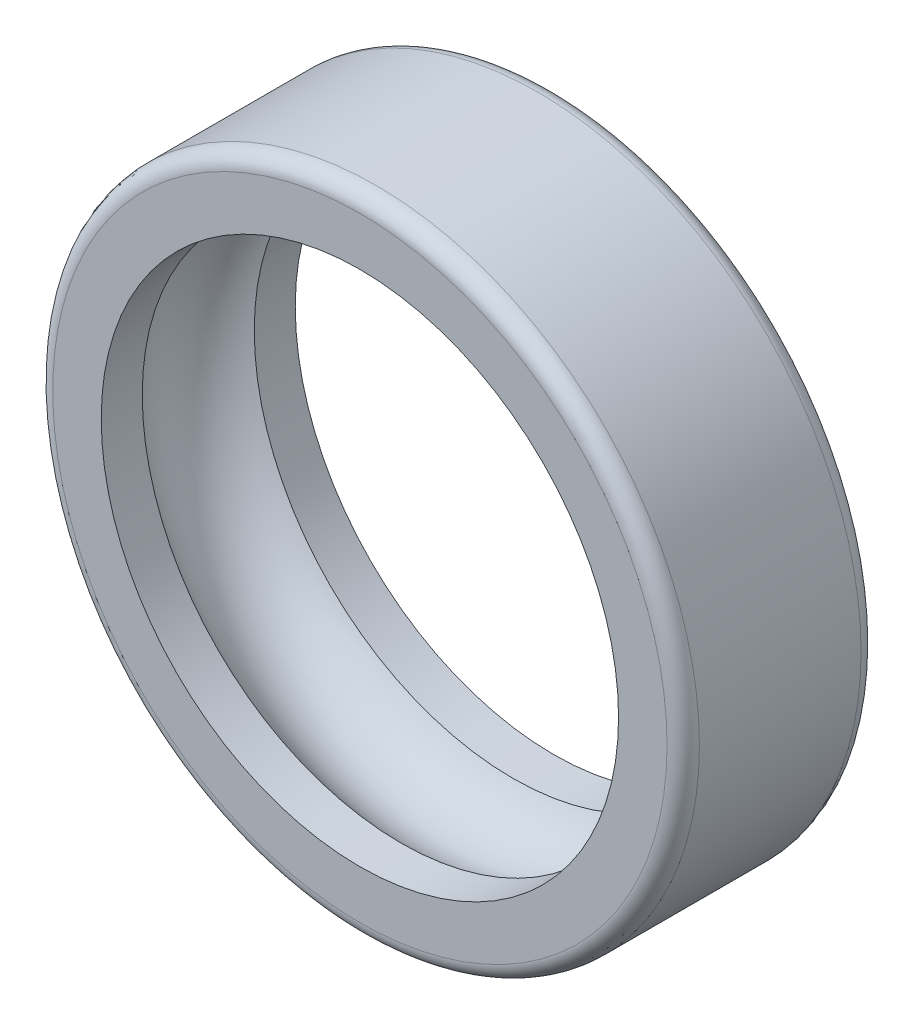
ISO-10303-21;
HEADER;
FILE_DESCRIPTION(('STEP AP214'),'2;1');
FILE_NAME('part.step','',(''),(''),'','','');
FILE_SCHEMA(('AUTOMOTIVE_DESIGN { 1 0 10303 214 1 1 1 1 }'));
ENDSEC;
DATA;
#1=APPLICATION_CONTEXT('core data for automotive mechanical design processes');
#2=APPLICATION_PROTOCOL_DEFINITION('international standard','automotive_design',2000,#1);
#3=PRODUCT_CONTEXT('',#1,'mechanical');
#4=PRODUCT('Part','Part','',(#3));
#5=PRODUCT_RELATED_PRODUCT_CATEGORY('part','',(#4));
#6=PRODUCT_DEFINITION_FORMATION('','',#4);
#7=PRODUCT_DEFINITION_CONTEXT('part definition',#1,'design');
#8=PRODUCT_DEFINITION('design','',#6,#7);
#9=PRODUCT_DEFINITION_SHAPE('','',#8);
#10=(LENGTH_UNIT() NAMED_UNIT(*) SI_UNIT(.MILLI.,.METRE.));
#11=(NAMED_UNIT(*) PLANE_ANGLE_UNIT() SI_UNIT($,.RADIAN.));
#12=(NAMED_UNIT(*) SI_UNIT($,.STERADIAN.) SOLID_ANGLE_UNIT());
#13=UNCERTAINTY_MEASURE_WITH_UNIT(LENGTH_MEASURE(1.E-05),#10,'distance_accuracy_value','');
#14=(GEOMETRIC_REPRESENTATION_CONTEXT(3) GLOBAL_UNCERTAINTY_ASSIGNED_CONTEXT((#13)) GLOBAL_UNIT_ASSIGNED_CONTEXT((#10,
#11,#12)) REPRESENTATION_CONTEXT('',''));
#15=CARTESIAN_POINT('',(0.,0.,0.));
#16=DIRECTION('',(0.,0.,1.));
#17=DIRECTION('',(1.,0.,0.));
#18=AXIS2_PLACEMENT_3D('',#15,#16,#17);
#19=CARTESIAN_POINT('',(0.,0.,3.));
#20=DIRECTION('',(0.,0.,-1.));
#21=DIRECTION('',(-1.,0.,0.));
#22=AXIS2_PLACEMENT_3D('',#19,#20,#21);
#23=CYLINDRICAL_SURFACE('',#22,8.);
#24=CARTESIAN_POINT('',(0.,0.,-1.73205080756888));
#25=DIRECTION('',(0.,0.,1.));
#26=DIRECTION('',(1.,0.,0.));
#27=AXIS2_PLACEMENT_3D('',#24,#25,#26);
#28=CIRCLE('',#27,8.);
#29=CARTESIAN_POINT('',(8.,0.,-1.73205080756888));
#30=VERTEX_POINT('',#29);
#31=EDGE_CURVE('E62',#30,#30,#28,.F.);
#32=ORIENTED_EDGE('',*,*,#31,.F.);
#33=EDGE_LOOP('',(#32));
#34=FACE_BOUND('',#33,.T.);
#35=CARTESIAN_POINT('',(0.,0.,-3.));
#36=DIRECTION('',(0.,0.,1.));
#37=DIRECTION('',(1.,0.,0.));
#38=AXIS2_PLACEMENT_3D('',#35,#36,#37);
#39=CIRCLE('',#38,8.);
#40=CARTESIAN_POINT('',(8.,0.,-3.));
#41=VERTEX_POINT('',#40);
#42=EDGE_CURVE('E66',#41,#41,#39,.T.);
#43=ORIENTED_EDGE('',*,*,#42,.F.);
#44=EDGE_LOOP('',(#43));
#45=FACE_BOUND('',#44,.T.);
#46=ADVANCED_FACE('F37',(#34,#45),#23,.F.);
#47=CARTESIAN_POINT('',(0.,0.,3.));
#48=DIRECTION('',(0.,0.,1.));
#49=DIRECTION('',(1.,0.,0.));
#50=AXIS2_PLACEMENT_3D('',#47,#48,#49);
#51=PLANE('',#50);
#52=CARTESIAN_POINT('',(0.,0.,3.));
#53=DIRECTION('',(0.,0.,1.));
#54=DIRECTION('',(1.,0.,0.));
#55=AXIS2_PLACEMENT_3D('',#52,#53,#54);
#56=CIRCLE('',#55,9.5);
#57=CARTESIAN_POINT('',(9.5,0.,3.));
#58=VERTEX_POINT('',#57);
#59=EDGE_CURVE('E10',#58,#58,#56,.T.);
#60=ORIENTED_EDGE('',*,*,#59,.T.);
#61=EDGE_LOOP('',(#60));
#62=FACE_BOUND('',#61,.T.);
#63=CARTESIAN_POINT('',(0.,0.,3.));
#64=DIRECTION('',(0.,0.,1.));
#65=DIRECTION('',(1.,0.,0.));
#66=AXIS2_PLACEMENT_3D('',#63,#64,#65);
#67=CIRCLE('',#66,8.);
#68=CARTESIAN_POINT('',(8.,0.,3.));
#69=VERTEX_POINT('',#68);
#70=EDGE_CURVE('E61',#69,#69,#67,.T.);
#71=ORIENTED_EDGE('',*,*,#70,.F.);
#72=EDGE_LOOP('',(#71));
#73=FACE_BOUND('',#72,.T.);
#74=ADVANCED_FACE('F80',(#62,#73),#51,.T.);
#75=CARTESIAN_POINT('',(0.,0.,-3.));
#76=DIRECTION('',(0.,0.,1.));
#77=DIRECTION('',(1.,0.,0.));
#78=AXIS2_PLACEMENT_3D('',#75,#76,#77);
#79=PLANE('',#78);
#80=CARTESIAN_POINT('',(0.,0.,-3.));
#81=DIRECTION('',(0.,0.,1.));
#82=DIRECTION('',(1.,0.,0.));
#83=AXIS2_PLACEMENT_3D('',#80,#81,#82);
#84=CIRCLE('',#83,9.5);
#85=CARTESIAN_POINT('',(9.5,0.,-3.));
#86=VERTEX_POINT('',#85);
#87=EDGE_CURVE('E45',#86,#86,#84,.F.);
#88=ORIENTED_EDGE('',*,*,#87,.T.);
#89=EDGE_LOOP('',(#88));
#90=FACE_BOUND('',#89,.T.);
#91=ORIENTED_EDGE('',*,*,#42,.T.);
#92=EDGE_LOOP('',(#91));
#93=FACE_BOUND('',#92,.T.);
#94=ADVANCED_FACE('F82',(#90,#93),#79,.F.);
#95=CARTESIAN_POINT('',(0.,0.,3.));
#96=DIRECTION('',(0.,0.,-1.));
#97=DIRECTION('',(-1.,0.,0.));
#98=AXIS2_PLACEMENT_3D('',#95,#96,#97);
#99=CYLINDRICAL_SURFACE('',#98,10.);
#100=CARTESIAN_POINT('',(0.,0.,-2.5));
#101=DIRECTION('',(0.,0.,1.));
#102=DIRECTION('',(1.,0.,0.));
#103=AXIS2_PLACEMENT_3D('',#100,#101,#102);
#104=CIRCLE('',#103,10.);
#105=CARTESIAN_POINT('',(10.,0.,-2.5));
#106=VERTEX_POINT('',#105);
#107=EDGE_CURVE('E50',#106,#106,#104,.T.);
#108=ORIENTED_EDGE('',*,*,#107,.T.);
#109=EDGE_LOOP('',(#108));
#110=FACE_BOUND('',#109,.T.);
#111=CARTESIAN_POINT('',(0.,0.,2.5));
#112=DIRECTION('',(0.,0.,1.));
#113=DIRECTION('',(1.,0.,0.));
#114=AXIS2_PLACEMENT_3D('',#111,#112,#113);
#115=CIRCLE('',#114,10.);
#116=CARTESIAN_POINT('',(10.,0.,2.5));
#117=VERTEX_POINT('',#116);
#118=EDGE_CURVE('E55',#117,#117,#115,.F.);
#119=ORIENTED_EDGE('',*,*,#118,.T.);
#120=EDGE_LOOP('',(#119));
#121=FACE_BOUND('',#120,.T.);
#122=ADVANCED_FACE('F88',(#110,#121),#99,.T.);
#123=CARTESIAN_POINT('',(0.,0.,1.73205080756888));
#124=DIRECTION('',(0.,0.,-1.));
#125=DIRECTION('',(-1.,0.,0.));
#126=AXIS2_PLACEMENT_3D('',#123,#124,#125);
#127=CIRCLE('',#126,8.);
#128=CARTESIAN_POINT('',(-8.,0.,1.73205080756888));
#129=VERTEX_POINT('',#128);
#130=EDGE_CURVE('E67',#129,#129,#127,.F.);
#131=ORIENTED_EDGE('',*,*,#130,.F.);
#132=EDGE_LOOP('',(#131));
#133=FACE_BOUND('',#132,.T.);
#134=ORIENTED_EDGE('',*,*,#70,.T.);
#135=EDGE_LOOP('',(#134));
#136=FACE_BOUND('',#135,.T.);
#137=ADVANCED_FACE('F78',(#133,#136),#23,.F.);
#138=CARTESIAN_POINT('',(0.,0.,0.));
#139=DIRECTION('',(0.,0.,-1.));
#140=DIRECTION('',(-1.,0.,0.));
#141=AXIS2_PLACEMENT_3D('',#138,#139,#140);
#142=TOROIDAL_SURFACE('',#141,7.,2.);
#143=ORIENTED_EDGE('',*,*,#31,.T.);
#144=EDGE_LOOP('',(#143));
#145=FACE_BOUND('',#144,.T.);
#146=ORIENTED_EDGE('',*,*,#130,.T.);
#147=EDGE_LOOP('',(#146));
#148=FACE_BOUND('',#147,.T.);
#149=ADVANCED_FACE('F98',(#145,#148),#142,.F.);
#150=CARTESIAN_POINT('',(0.,0.,-2.5));
#151=DIRECTION('',(0.,0.,1.));
#152=DIRECTION('',(1.,0.,0.));
#153=AXIS2_PLACEMENT_3D('',#150,#151,#152);
#154=TOROIDAL_SURFACE('',#153,9.5,0.5);
#155=ORIENTED_EDGE('',*,*,#87,.F.);
#156=EDGE_LOOP('',(#155));
#157=FACE_BOUND('',#156,.T.);
#158=ORIENTED_EDGE('',*,*,#107,.F.);
#159=EDGE_LOOP('',(#158));
#160=FACE_BOUND('',#159,.T.);
#161=ADVANCED_FACE('F96',(#157,#160),#154,.T.);
#162=CARTESIAN_POINT('',(0.,0.,2.5));
#163=DIRECTION('',(0.,0.,1.));
#164=DIRECTION('',(1.,0.,0.));
#165=AXIS2_PLACEMENT_3D('',#162,#163,#164);
#166=TOROIDAL_SURFACE('',#165,9.5,0.5);
#167=ORIENTED_EDGE('',*,*,#118,.F.);
#168=EDGE_LOOP('',(#167));
#169=FACE_BOUND('',#168,.T.);
#170=ORIENTED_EDGE('',*,*,#59,.F.);
#171=EDGE_LOOP('',(#170));
#172=FACE_BOUND('',#171,.T.);
#173=ADVANCED_FACE('F39',(#169,#172),#166,.T.);
#174=CLOSED_SHELL('',(#46,#74,#94,#122,#137,#149,#161,#173));
#175=MANIFOLD_SOLID_BREP('B2',#174);
#176=ADVANCED_BREP_SHAPE_REPRESENTATION('',(#18,#175),#14);
#177=SHAPE_DEFINITION_REPRESENTATION(#9,#176);
ENDSEC;
END-ISO-10303-21;
